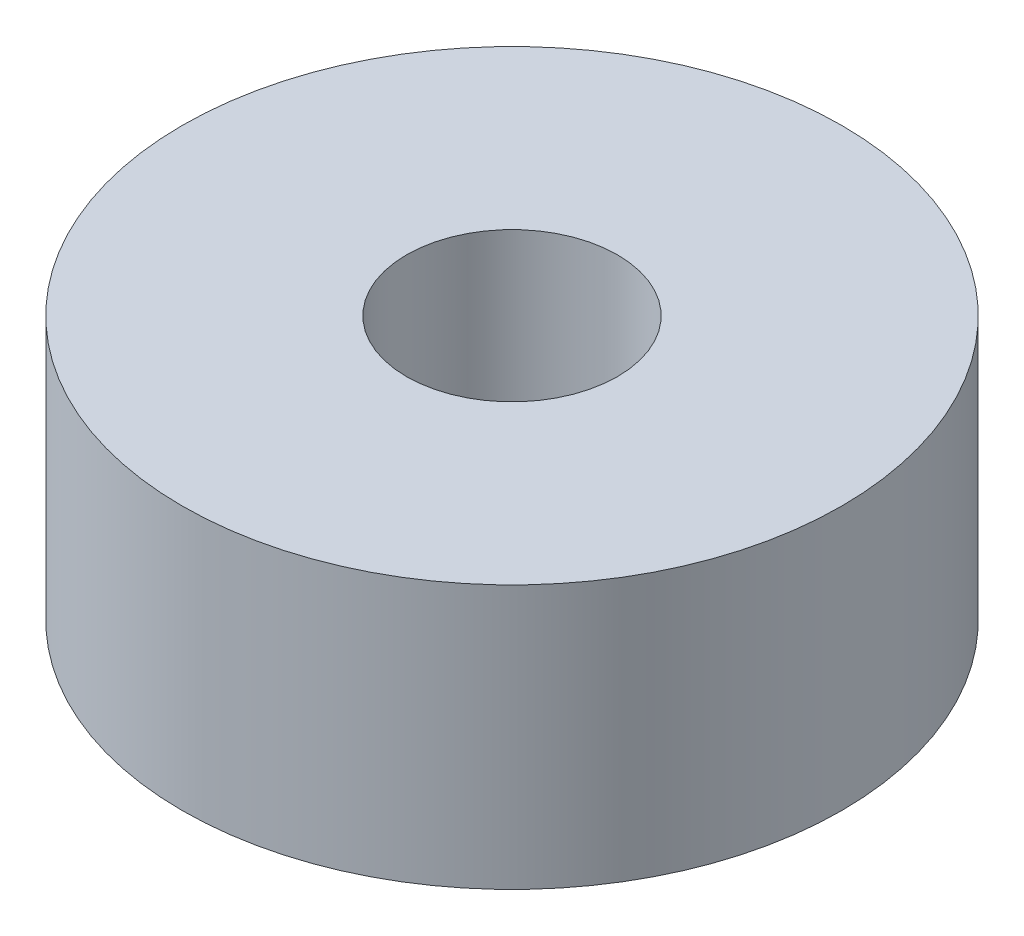
ISO-10303-21;
HEADER;
FILE_DESCRIPTION(('STEP AP214'),'2;1');
FILE_NAME('part.step','',(''),(''),'','','');
FILE_SCHEMA(('AUTOMOTIVE_DESIGN { 1 0 10303 214 1 1 1 1 }'));
ENDSEC;
DATA;
#1=APPLICATION_CONTEXT('core data for automotive mechanical design processes');
#2=APPLICATION_PROTOCOL_DEFINITION('international standard','automotive_design',2000,#1);
#3=PRODUCT_CONTEXT('',#1,'mechanical');
#4=PRODUCT('Part','Part','',(#3));
#5=PRODUCT_RELATED_PRODUCT_CATEGORY('part','',(#4));
#6=PRODUCT_DEFINITION_FORMATION('','',#4);
#7=PRODUCT_DEFINITION_CONTEXT('part definition',#1,'design');
#8=PRODUCT_DEFINITION('design','',#6,#7);
#9=PRODUCT_DEFINITION_SHAPE('','',#8);
#10=(LENGTH_UNIT() NAMED_UNIT(*) SI_UNIT(.MILLI.,.METRE.));
#11=(NAMED_UNIT(*) PLANE_ANGLE_UNIT() SI_UNIT($,.RADIAN.));
#12=(NAMED_UNIT(*) SI_UNIT($,.STERADIAN.) SOLID_ANGLE_UNIT());
#13=UNCERTAINTY_MEASURE_WITH_UNIT(LENGTH_MEASURE(1.E-05),#10,'distance_accuracy_value','');
#14=(GEOMETRIC_REPRESENTATION_CONTEXT(3) GLOBAL_UNCERTAINTY_ASSIGNED_CONTEXT((#13)) GLOBAL_UNIT_ASSIGNED_CONTEXT((#10,
#11,#12)) REPRESENTATION_CONTEXT('',''));
#15=CARTESIAN_POINT('',(0.,0.,0.));
#16=DIRECTION('',(0.,0.,1.));
#17=DIRECTION('',(1.,0.,0.));
#18=AXIS2_PLACEMENT_3D('',#15,#16,#17);
#19=CARTESIAN_POINT('',(0.,10.,0.));
#20=DIRECTION('',(0.,1.,0.));
#21=DIRECTION('',(0.,0.,1.));
#22=AXIS2_PLACEMENT_3D('',#19,#20,#21);
#23=PLANE('',#22);
#24=CARTESIAN_POINT('',(0.,10.,0.));
#25=DIRECTION('',(0.,1.,0.));
#26=DIRECTION('',(0.,0.,1.));
#27=AXIS2_PLACEMENT_3D('',#24,#25,#26);
#28=CIRCLE('',#27,12.5);
#29=CARTESIAN_POINT('',(0.,10.,12.5));
#30=VERTEX_POINT('',#29);
#31=EDGE_CURVE('E10',#30,#30,#28,.T.);
#32=ORIENTED_EDGE('',*,*,#31,.T.);
#33=EDGE_LOOP('',(#32));
#34=FACE_BOUND('',#33,.T.);
#35=CARTESIAN_POINT('',(0.,10.,0.));
#36=DIRECTION('',(0.,1.,0.));
#37=DIRECTION('',(0.,0.,1.));
#38=AXIS2_PLACEMENT_3D('',#35,#36,#37);
#39=CIRCLE('',#38,4.);
#40=CARTESIAN_POINT('',(0.,10.,4.));
#41=VERTEX_POINT('',#40);
#42=EDGE_CURVE('E46',#41,#41,#39,.T.);
#43=ORIENTED_EDGE('',*,*,#42,.F.);
#44=EDGE_LOOP('',(#43));
#45=FACE_BOUND('',#44,.T.);
#46=ADVANCED_FACE('F35',(#34,#45),#23,.T.);
#47=CARTESIAN_POINT('',(0.,0.,0.));
#48=DIRECTION('',(0.,1.,0.));
#49=DIRECTION('',(0.,0.,1.));
#50=AXIS2_PLACEMENT_3D('',#47,#48,#49);
#51=PLANE('',#50);
#52=CARTESIAN_POINT('',(0.,0.,0.));
#53=DIRECTION('',(0.,1.,0.));
#54=DIRECTION('',(0.,0.,1.));
#55=AXIS2_PLACEMENT_3D('',#52,#53,#54);
#56=CIRCLE('',#55,12.5);
#57=CARTESIAN_POINT('',(0.,0.,12.5));
#58=VERTEX_POINT('',#57);
#59=EDGE_CURVE('E39',#58,#58,#56,.T.);
#60=ORIENTED_EDGE('',*,*,#59,.F.);
#61=EDGE_LOOP('',(#60));
#62=FACE_BOUND('',#61,.T.);
#63=CARTESIAN_POINT('',(0.,0.,0.));
#64=DIRECTION('',(0.,1.,0.));
#65=DIRECTION('',(0.,0.,1.));
#66=AXIS2_PLACEMENT_3D('',#63,#64,#65);
#67=CIRCLE('',#66,4.);
#68=CARTESIAN_POINT('',(0.,0.,4.));
#69=VERTEX_POINT('',#68);
#70=EDGE_CURVE('E48',#69,#69,#67,.T.);
#71=ORIENTED_EDGE('',*,*,#70,.T.);
#72=EDGE_LOOP('',(#71));
#73=FACE_BOUND('',#72,.T.);
#74=ADVANCED_FACE('F58',(#62,#73),#51,.F.);
#75=CARTESIAN_POINT('',(0.,10.,0.));
#76=DIRECTION('',(0.,-1.,0.));
#77=DIRECTION('',(0.,0.,-1.));
#78=AXIS2_PLACEMENT_3D('',#75,#76,#77);
#79=CYLINDRICAL_SURFACE('',#78,12.5);
#80=ORIENTED_EDGE('',*,*,#31,.F.);
#81=EDGE_LOOP('',(#80));
#82=FACE_BOUND('',#81,.T.);
#83=ORIENTED_EDGE('',*,*,#59,.T.);
#84=EDGE_LOOP('',(#83));
#85=FACE_BOUND('',#84,.T.);
#86=ADVANCED_FACE('F37',(#82,#85),#79,.T.);
#87=CARTESIAN_POINT('',(0.,10.,0.));
#88=DIRECTION('',(0.,-1.,0.));
#89=DIRECTION('',(0.,0.,-1.));
#90=AXIS2_PLACEMENT_3D('',#87,#88,#89);
#91=CYLINDRICAL_SURFACE('',#90,4.);
#92=ORIENTED_EDGE('',*,*,#42,.T.);
#93=EDGE_LOOP('',(#92));
#94=FACE_BOUND('',#93,.T.);
#95=ORIENTED_EDGE('',*,*,#70,.F.);
#96=EDGE_LOOP('',(#95));
#97=FACE_BOUND('',#96,.T.);
#98=ADVANCED_FACE('F54',(#94,#97),#91,.F.);
#99=CLOSED_SHELL('',(#46,#74,#86,#98));
#100=MANIFOLD_SOLID_BREP('B2',#99);
#101=ADVANCED_BREP_SHAPE_REPRESENTATION('',(#18,#100),#14);
#102=SHAPE_DEFINITION_REPRESENTATION(#9,#101);
ENDSEC;
END-ISO-10303-21;
